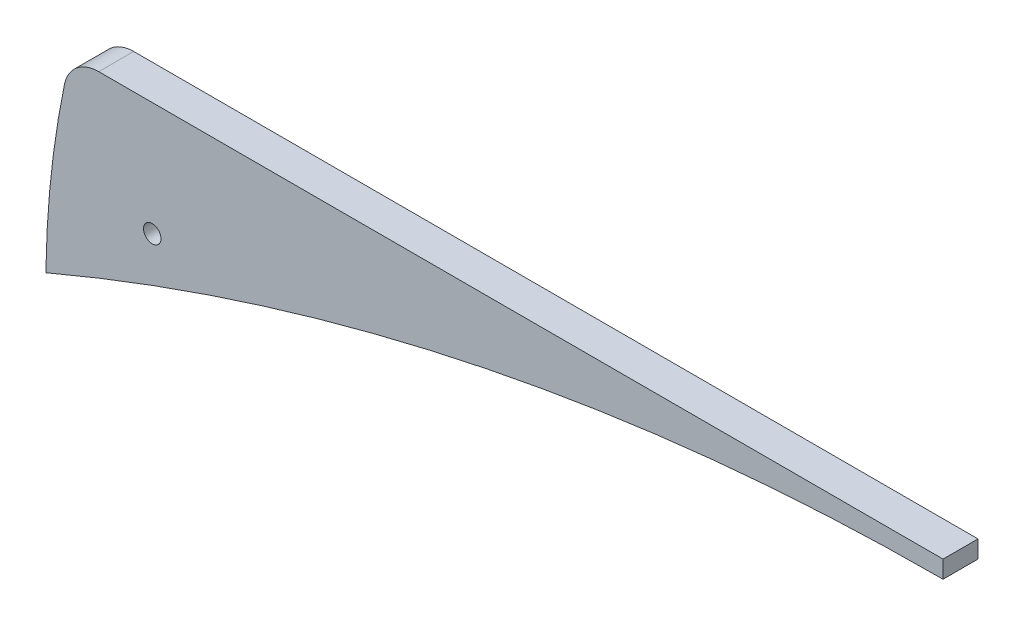
ISO-10303-21;
HEADER;
FILE_DESCRIPTION(('STEP AP214'),'2;1');
FILE_NAME('part.step','',(''),(''),'','','');
FILE_SCHEMA(('AUTOMOTIVE_DESIGN { 1 0 10303 214 1 1 1 1 }'));
ENDSEC;
DATA;
#1=APPLICATION_CONTEXT('core data for automotive mechanical design processes');
#2=APPLICATION_PROTOCOL_DEFINITION('international standard','automotive_design',2000,#1);
#3=PRODUCT_CONTEXT('',#1,'mechanical');
#4=PRODUCT('Part','Part','',(#3));
#5=PRODUCT_RELATED_PRODUCT_CATEGORY('part','',(#4));
#6=PRODUCT_DEFINITION_FORMATION('','',#4);
#7=PRODUCT_DEFINITION_CONTEXT('part definition',#1,'design');
#8=PRODUCT_DEFINITION('design','',#6,#7);
#9=PRODUCT_DEFINITION_SHAPE('','',#8);
#10=(LENGTH_UNIT() NAMED_UNIT(*) SI_UNIT(.MILLI.,.METRE.));
#11=(NAMED_UNIT(*) PLANE_ANGLE_UNIT() SI_UNIT($,.RADIAN.));
#12=(NAMED_UNIT(*) SI_UNIT($,.STERADIAN.) SOLID_ANGLE_UNIT());
#13=UNCERTAINTY_MEASURE_WITH_UNIT(LENGTH_MEASURE(1.E-05),#10,'distance_accuracy_value','');
#14=(GEOMETRIC_REPRESENTATION_CONTEXT(3) GLOBAL_UNCERTAINTY_ASSIGNED_CONTEXT((#13)) GLOBAL_UNIT_ASSIGNED_CONTEXT((#10,
#11,#12)) REPRESENTATION_CONTEXT('',''));
#15=CARTESIAN_POINT('',(0.,0.,0.));
#16=DIRECTION('',(0.,0.,1.));
#17=DIRECTION('',(1.,0.,0.));
#18=AXIS2_PLACEMENT_3D('',#15,#16,#17);
#19=CARTESIAN_POINT('',(-48.3078238308103,9.99999999999999,2.));
#20=DIRECTION('',(0.,0.,1.));
#21=DIRECTION('',(1.,0.,0.));
#22=AXIS2_PLACEMENT_3D('',#19,#20,#21);
#23=PLANE('',#22);
#24=DIRECTION('',(-1.,0.,0.));
#25=VECTOR('',#24,1.);
#26=CARTESIAN_POINT('',(0.,12.,2.));
#27=LINE('',#26,#25);
#28=CARTESIAN_POINT('',(0.,12.,2.));
#29=VERTEX_POINT('',#28);
#30=CARTESIAN_POINT('',(-48.3078238308103,12.,2.));
#31=VERTEX_POINT('',#30);
#32=EDGE_CURVE('E129',#29,#31,#27,.T.);
#33=ORIENTED_EDGE('',*,*,#32,.T.);
#34=CARTESIAN_POINT('',(-48.3078238308103,9.99999999999999,2.));
#35=DIRECTION('',(0.,0.,1.));
#36=DIRECTION('',(1.,0.,0.));
#37=AXIS2_PLACEMENT_3D('',#34,#35,#36);
#38=CIRCLE('',#37,2.);
#39=CARTESIAN_POINT('',(-50.2663022062894,10.405416394317,2.));
#40=VERTEX_POINT('',#39);
#41=EDGE_CURVE('E87',#31,#40,#38,.T.);
#42=ORIENTED_EDGE('',*,*,#41,.T.);
#43=CARTESIAN_POINT('',(0.,0.,2.));
#44=DIRECTION('',(0.,0.,1.));
#45=DIRECTION('',(1.,0.,0.));
#46=AXIS2_PLACEMENT_3D('',#43,#44,#45);
#47=CIRCLE('',#46,51.3319961411315);
#48=CARTESIAN_POINT('',(-51.3262339249071,0.769115673262911,2.));
#49=VERTEX_POINT('',#48);
#50=EDGE_CURVE('E100',#40,#49,#47,.T.);
#51=ORIENTED_EDGE('',*,*,#50,.T.);
#52=CARTESIAN_POINT('',(-49.3264584326862,0.739149346952585,2.));
#53=DIRECTION('',(0.,0.,1.));
#54=DIRECTION('',(1.,0.,0.));
#55=AXIS2_PLACEMENT_3D('',#52,#53,#54);
#56=CIRCLE('',#55,1.99999999999995);
#57=CARTESIAN_POINT('',(-51.3155922100697,0.530950365994529,2.));
#58=VERTEX_POINT('',#57);
#59=EDGE_CURVE('E94',#49,#58,#56,.T.);
#60=ORIENTED_EDGE('',*,*,#59,.T.);
#61=CARTESIAN_POINT('',(0.,-120.,2.));
#62=DIRECTION('',(0.,0.,-1.));
#63=DIRECTION('',(1.,0.,0.));
#64=AXIS2_PLACEMENT_3D('',#61,#62,#63);
#65=CIRCLE('',#64,131.);
#66=CARTESIAN_POINT('',(0.,11.,2.));
#67=VERTEX_POINT('',#66);
#68=EDGE_CURVE('E98',#58,#67,#65,.T.);
#69=ORIENTED_EDGE('',*,*,#68,.T.);
#70=DIRECTION('',(0.,1.,0.));
#71=VECTOR('',#70,1.);
#72=CARTESIAN_POINT('',(0.,11.,2.));
#73=LINE('',#72,#71);
#74=EDGE_CURVE('E50',#67,#29,#73,.T.);
#75=ORIENTED_EDGE('',*,*,#74,.T.);
#76=EDGE_LOOP('',(#33,#42,#51,#60,#69,#75));
#77=FACE_BOUND('',#76,.T.);
#78=CARTESIAN_POINT('',(-45.24663001469,5.49999999999999,2.));
#79=DIRECTION('',(0.,0.,1.));
#80=DIRECTION('',(1.,0.,0.));
#81=AXIS2_PLACEMENT_3D('',#78,#79,#80);
#82=CIRCLE('',#81,0.499999999999999);
#83=CARTESIAN_POINT('',(-44.74663001469,5.49999999999999,2.));
#84=VERTEX_POINT('',#83);
#85=EDGE_CURVE('E122',#84,#84,#82,.T.);
#86=ORIENTED_EDGE('',*,*,#85,.F.);
#87=EDGE_LOOP('',(#86));
#88=FACE_BOUND('',#87,.T.);
#89=ADVANCED_FACE('F33',(#77,#88),#23,.T.);
#90=CARTESIAN_POINT('',(-48.3078238308103,9.99999999999999,0.));
#91=DIRECTION('',(0.,0.,1.));
#92=DIRECTION('',(1.,0.,0.));
#93=AXIS2_PLACEMENT_3D('',#90,#91,#92);
#94=PLANE('',#93);
#95=DIRECTION('',(-1.,0.,0.));
#96=VECTOR('',#95,1.);
#97=CARTESIAN_POINT('',(0.,12.,0.));
#98=LINE('',#97,#96);
#99=CARTESIAN_POINT('',(0.,12.,0.));
#100=VERTEX_POINT('',#99);
#101=CARTESIAN_POINT('',(-48.3078238308103,12.,0.));
#102=VERTEX_POINT('',#101);
#103=EDGE_CURVE('E118',#100,#102,#98,.T.);
#104=ORIENTED_EDGE('',*,*,#103,.F.);
#105=DIRECTION('',(0.,1.,0.));
#106=VECTOR('',#105,1.);
#107=CARTESIAN_POINT('',(0.,11.,0.));
#108=LINE('',#107,#106);
#109=CARTESIAN_POINT('',(0.,11.,0.));
#110=VERTEX_POINT('',#109);
#111=EDGE_CURVE('E79',#110,#100,#108,.T.);
#112=ORIENTED_EDGE('',*,*,#111,.F.);
#113=CARTESIAN_POINT('',(0.,-120.,0.));
#114=DIRECTION('',(0.,0.,-1.));
#115=DIRECTION('',(1.,0.,0.));
#116=AXIS2_PLACEMENT_3D('',#113,#114,#115);
#117=CIRCLE('',#116,131.);
#118=CARTESIAN_POINT('',(-51.3155922100697,0.530950365994529,0.));
#119=VERTEX_POINT('',#118);
#120=EDGE_CURVE('E73',#119,#110,#117,.T.);
#121=ORIENTED_EDGE('',*,*,#120,.F.);
#122=CARTESIAN_POINT('',(-49.3264584326862,0.739149346952585,0.));
#123=DIRECTION('',(0.,0.,1.));
#124=DIRECTION('',(1.,0.,0.));
#125=AXIS2_PLACEMENT_3D('',#122,#123,#124);
#126=CIRCLE('',#125,1.99999999999995);
#127=CARTESIAN_POINT('',(-51.3262339249071,0.769115673262911,0.));
#128=VERTEX_POINT('',#127);
#129=EDGE_CURVE('E108',#128,#119,#126,.T.);
#130=ORIENTED_EDGE('',*,*,#129,.F.);
#131=CARTESIAN_POINT('',(0.,0.,0.));
#132=DIRECTION('',(0.,0.,1.));
#133=DIRECTION('',(1.,0.,0.));
#134=AXIS2_PLACEMENT_3D('',#131,#132,#133);
#135=CIRCLE('',#134,51.3319961411315);
#136=CARTESIAN_POINT('',(-50.2663022062894,10.405416394317,0.));
#137=VERTEX_POINT('',#136);
#138=EDGE_CURVE('E124',#137,#128,#135,.T.);
#139=ORIENTED_EDGE('',*,*,#138,.F.);
#140=CARTESIAN_POINT('',(-48.3078238308103,9.99999999999999,0.));
#141=DIRECTION('',(0.,0.,1.));
#142=DIRECTION('',(1.,0.,0.));
#143=AXIS2_PLACEMENT_3D('',#140,#141,#142);
#144=CIRCLE('',#143,2.);
#145=EDGE_CURVE('E121',#102,#137,#144,.T.);
#146=ORIENTED_EDGE('',*,*,#145,.F.);
#147=EDGE_LOOP('',(#104,#112,#121,#130,#139,#146));
#148=FACE_BOUND('',#147,.T.);
#149=CARTESIAN_POINT('',(-45.24663001469,5.49999999999999,0.));
#150=DIRECTION('',(0.,0.,1.));
#151=DIRECTION('',(1.,0.,0.));
#152=AXIS2_PLACEMENT_3D('',#149,#150,#151);
#153=CIRCLE('',#152,0.499999999999999);
#154=CARTESIAN_POINT('',(-44.74663001469,5.49999999999999,0.));
#155=VERTEX_POINT('',#154);
#156=EDGE_CURVE('E222',#155,#155,#153,.T.);
#157=ORIENTED_EDGE('',*,*,#156,.T.);
#158=EDGE_LOOP('',(#157));
#159=FACE_BOUND('',#158,.T.);
#160=ADVANCED_FACE('F138',(#148,#159),#94,.F.);
#161=CARTESIAN_POINT('',(0.,12.,2.));
#162=DIRECTION('',(0.,-1.,0.));
#163=DIRECTION('',(1.,0.,0.));
#164=AXIS2_PLACEMENT_3D('',#161,#162,#163);
#165=PLANE('',#164);
#166=ORIENTED_EDGE('',*,*,#103,.T.);
#167=DIRECTION('',(0.,0.,-1.));
#168=VECTOR('',#167,1.);
#169=CARTESIAN_POINT('',(-48.3078238308103,12.,2.));
#170=LINE('',#169,#168);
#171=EDGE_CURVE('E11',#31,#102,#170,.T.);
#172=ORIENTED_EDGE('',*,*,#171,.F.);
#173=ORIENTED_EDGE('',*,*,#32,.F.);
#174=DIRECTION('',(0.,0.,-1.));
#175=VECTOR('',#174,1.);
#176=CARTESIAN_POINT('',(0.,12.,2.));
#177=LINE('',#176,#175);
#178=EDGE_CURVE('E114',#29,#100,#177,.T.);
#179=ORIENTED_EDGE('',*,*,#178,.T.);
#180=EDGE_LOOP('',(#166,#172,#173,#179));
#181=FACE_BOUND('',#180,.T.);
#182=ADVANCED_FACE('F35',(#181),#165,.F.);
#183=CARTESIAN_POINT('',(-48.3078238308103,9.99999999999999,2.));
#184=DIRECTION('',(0.,0.,-1.));
#185=DIRECTION('',(-1.,0.,0.));
#186=AXIS2_PLACEMENT_3D('',#183,#184,#185);
#187=CYLINDRICAL_SURFACE('',#186,2.);
#188=ORIENTED_EDGE('',*,*,#145,.T.);
#189=DIRECTION('',(0.,0.,-1.));
#190=VECTOR('',#189,1.);
#191=CARTESIAN_POINT('',(-50.2663022062894,10.405416394317,2.));
#192=LINE('',#191,#190);
#193=EDGE_CURVE('E42',#40,#137,#192,.T.);
#194=ORIENTED_EDGE('',*,*,#193,.F.);
#195=ORIENTED_EDGE('',*,*,#41,.F.);
#196=ORIENTED_EDGE('',*,*,#171,.T.);
#197=EDGE_LOOP('',(#188,#194,#195,#196));
#198=FACE_BOUND('',#197,.T.);
#199=ADVANCED_FACE('F163',(#198),#187,.T.);
#200=CARTESIAN_POINT('',(0.,0.,2.));
#201=DIRECTION('',(0.,0.,-1.));
#202=DIRECTION('',(-1.,0.,0.));
#203=AXIS2_PLACEMENT_3D('',#200,#201,#202);
#204=CYLINDRICAL_SURFACE('',#203,51.3319961411315);
#205=ORIENTED_EDGE('',*,*,#138,.T.);
#206=DIRECTION('',(0.,0.,-1.));
#207=VECTOR('',#206,1.);
#208=CARTESIAN_POINT('',(-51.3262339249071,0.769115673262911,2.));
#209=LINE('',#208,#207);
#210=EDGE_CURVE('E109',#49,#128,#209,.T.);
#211=ORIENTED_EDGE('',*,*,#210,.F.);
#212=ORIENTED_EDGE('',*,*,#50,.F.);
#213=ORIENTED_EDGE('',*,*,#193,.T.);
#214=EDGE_LOOP('',(#205,#211,#212,#213));
#215=FACE_BOUND('',#214,.T.);
#216=ADVANCED_FACE('F135',(#215),#204,.T.);
#217=CARTESIAN_POINT('',(-49.3264584326862,0.739149346952585,2.));
#218=DIRECTION('',(0.,0.,-1.));
#219=DIRECTION('',(-1.,0.,0.));
#220=AXIS2_PLACEMENT_3D('',#217,#218,#219);
#221=CYLINDRICAL_SURFACE('',#220,1.99999999999995);
#222=ORIENTED_EDGE('',*,*,#129,.T.);
#223=DIRECTION('',(0.,0.,-1.));
#224=VECTOR('',#223,1.);
#225=CARTESIAN_POINT('',(-51.3155922100697,0.530950365994529,2.));
#226=LINE('',#225,#224);
#227=EDGE_CURVE('E105',#58,#119,#226,.T.);
#228=ORIENTED_EDGE('',*,*,#227,.F.);
#229=ORIENTED_EDGE('',*,*,#59,.F.);
#230=ORIENTED_EDGE('',*,*,#210,.T.);
#231=EDGE_LOOP('',(#222,#228,#229,#230));
#232=FACE_BOUND('',#231,.T.);
#233=ADVANCED_FACE('F106',(#232),#221,.T.);
#234=CARTESIAN_POINT('',(0.,-120.,2.));
#235=DIRECTION('',(0.,0.,-1.));
#236=DIRECTION('',(-1.,0.,0.));
#237=AXIS2_PLACEMENT_3D('',#234,#235,#236);
#238=CYLINDRICAL_SURFACE('',#237,131.);
#239=ORIENTED_EDGE('',*,*,#120,.T.);
#240=DIRECTION('',(0.,0.,-1.));
#241=VECTOR('',#240,1.);
#242=CARTESIAN_POINT('',(0.,11.,2.));
#243=LINE('',#242,#241);
#244=EDGE_CURVE('E110',#67,#110,#243,.T.);
#245=ORIENTED_EDGE('',*,*,#244,.F.);
#246=ORIENTED_EDGE('',*,*,#68,.F.);
#247=ORIENTED_EDGE('',*,*,#227,.T.);
#248=EDGE_LOOP('',(#239,#245,#246,#247));
#249=FACE_BOUND('',#248,.T.);
#250=ADVANCED_FACE('F112',(#249),#238,.F.);
#251=CARTESIAN_POINT('',(0.,11.,2.));
#252=DIRECTION('',(-1.,0.,0.));
#253=DIRECTION('',(0.,-1.,0.));
#254=AXIS2_PLACEMENT_3D('',#251,#252,#253);
#255=PLANE('',#254);
#256=ORIENTED_EDGE('',*,*,#111,.T.);
#257=ORIENTED_EDGE('',*,*,#178,.F.);
#258=ORIENTED_EDGE('',*,*,#74,.F.);
#259=ORIENTED_EDGE('',*,*,#244,.T.);
#260=EDGE_LOOP('',(#256,#257,#258,#259));
#261=FACE_BOUND('',#260,.T.);
#262=ADVANCED_FACE('F143',(#261),#255,.F.);
#263=CARTESIAN_POINT('',(-45.24663001469,5.49999999999999,2.));
#264=DIRECTION('',(0.,0.,-1.));
#265=DIRECTION('',(-1.,0.,0.));
#266=AXIS2_PLACEMENT_3D('',#263,#264,#265);
#267=CYLINDRICAL_SURFACE('',#266,0.499999999999999);
#268=ORIENTED_EDGE('',*,*,#85,.T.);
#269=EDGE_LOOP('',(#268));
#270=FACE_BOUND('',#269,.T.);
#271=ORIENTED_EDGE('',*,*,#156,.F.);
#272=EDGE_LOOP('',(#271));
#273=FACE_BOUND('',#272,.T.);
#274=ADVANCED_FACE('F145',(#270,#273),#267,.F.);
#275=CLOSED_SHELL('',(#89,#160,#182,#199,#216,#233,#250,#262,#274));
#276=MANIFOLD_SOLID_BREP('B2',#275);
#277=ADVANCED_BREP_SHAPE_REPRESENTATION('',(#18,#276),#14);
#278=SHAPE_DEFINITION_REPRESENTATION(#9,#277);
ENDSEC;
END-ISO-10303-21;
